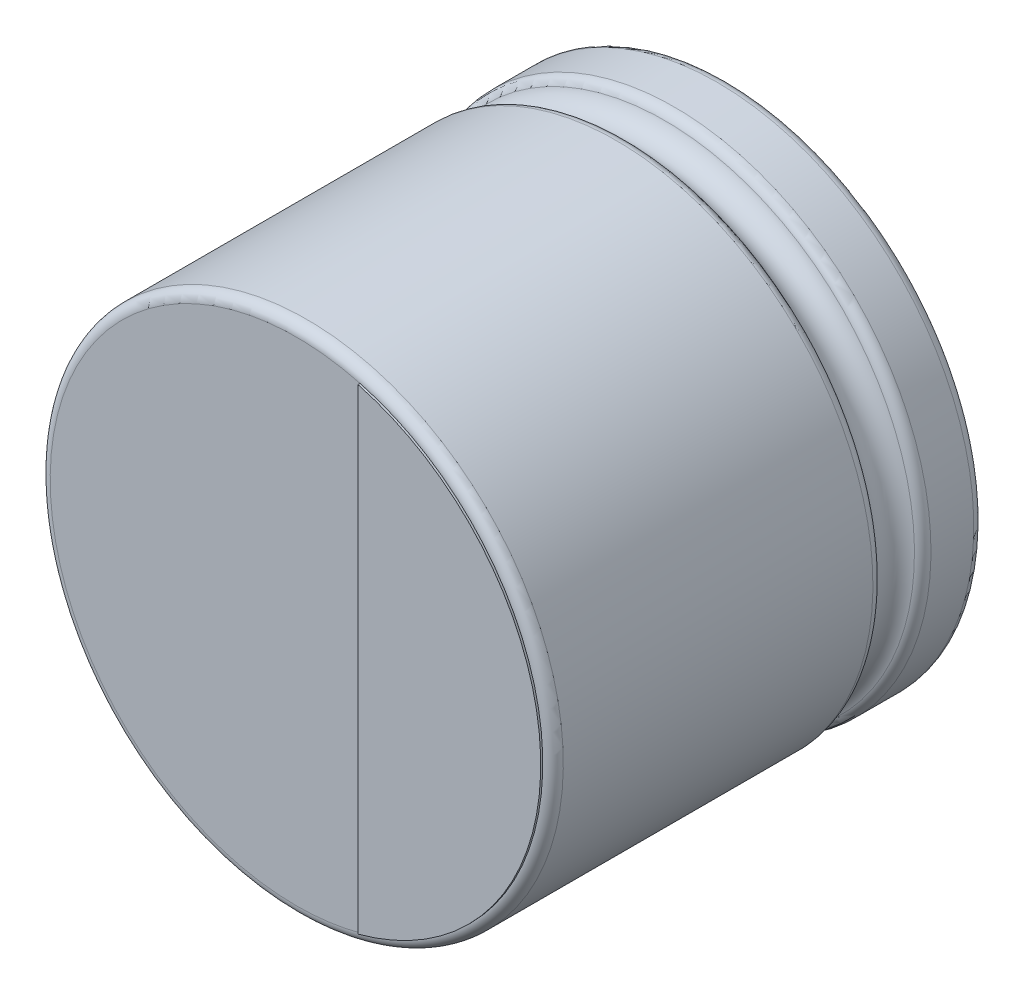
ISO-10303-21;
HEADER;
FILE_DESCRIPTION(('STEP AP214'),'2;1');
FILE_NAME('part.step','',(''),(''),'','','');
FILE_SCHEMA(('AUTOMOTIVE_DESIGN { 1 0 10303 214 1 1 1 1 }'));
ENDSEC;
DATA;
#1=APPLICATION_CONTEXT('core data for automotive mechanical design processes');
#2=APPLICATION_PROTOCOL_DEFINITION('international standard','automotive_design',2000,#1);
#3=PRODUCT_CONTEXT('',#1,'mechanical');
#4=PRODUCT('Part','Part','',(#3));
#5=PRODUCT_RELATED_PRODUCT_CATEGORY('part','',(#4));
#6=PRODUCT_DEFINITION_FORMATION('','',#4);
#7=PRODUCT_DEFINITION_CONTEXT('part definition',#1,'design');
#8=PRODUCT_DEFINITION('design','',#6,#7);
#9=PRODUCT_DEFINITION_SHAPE('','',#8);
#10=(LENGTH_UNIT() NAMED_UNIT(*) SI_UNIT(.MILLI.,.METRE.));
#11=(NAMED_UNIT(*) PLANE_ANGLE_UNIT() SI_UNIT($,.RADIAN.));
#12=(NAMED_UNIT(*) SI_UNIT($,.STERADIAN.) SOLID_ANGLE_UNIT());
#13=UNCERTAINTY_MEASURE_WITH_UNIT(LENGTH_MEASURE(1.E-05),#10,'distance_accuracy_value','');
#14=(GEOMETRIC_REPRESENTATION_CONTEXT(3) GLOBAL_UNCERTAINTY_ASSIGNED_CONTEXT((#13)) GLOBAL_UNIT_ASSIGNED_CONTEXT((#10,
#11,#12)) REPRESENTATION_CONTEXT('',''));
#15=CARTESIAN_POINT('',(0.,0.,0.));
#16=DIRECTION('',(0.,0.,1.));
#17=DIRECTION('',(1.,0.,0.));
#18=AXIS2_PLACEMENT_3D('',#15,#16,#17);
#19=CARTESIAN_POINT('',(10.549,-3.885,7.12));
#20=DIRECTION('',(0.,0.,1.));
#21=DIRECTION('',(1.,0.,0.));
#22=AXIS2_PLACEMENT_3D('',#19,#20,#21);
#23=PLANE('',#22);
#24=DIRECTION('',(0.,1.,0.));
#25=VECTOR('',#24,1.);
#26=CARTESIAN_POINT('',(11.16804339705,-6.203789613704,7.12000000001));
#27=LINE('',#26,#25);
#28=CARTESIAN_POINT('',(11.16804339704,-6.203789613694,7.12));
#29=VERTEX_POINT('',#28);
#30=CARTESIAN_POINT('',(11.16804339704,-1.566210386306,7.12));
#31=VERTEX_POINT('',#30);
#32=EDGE_CURVE('E121',#29,#31,#27,.T.);
#33=ORIENTED_EDGE('',*,*,#32,.F.);
#34=CARTESIAN_POINT('',(10.54900000001,-3.88500000001,7.12000000001));
#35=DIRECTION('',(0.,0.,1.));
#36=DIRECTION('',(0.257934748771542,-0.966162339038405,0.));
#37=AXIS2_PLACEMENT_3D('',#34,#35,#36);
#38=CIRCLE('',#37,2.40000000001224);
#39=EDGE_CURVE('E11',#29,#31,#38,.T.);
#40=ORIENTED_EDGE('',*,*,#39,.T.);
#41=EDGE_LOOP('',(#33,#40));
#42=FACE_BOUND('',#41,.T.);
#43=ADVANCED_FACE('F17',(#42),#23,.T.);
#44=CARTESIAN_POINT('',(10.549,-3.885,7.12));
#45=DIRECTION('',(0.,0.,-1.));
#46=DIRECTION('',(0.,1.,0.));
#47=AXIS2_PLACEMENT_3D('',#44,#45,#46);
#48=CYLINDRICAL_SURFACE('',#47,2.4);
#49=DIRECTION('',(5.00088817591926E-10,0.,1.));
#50=VECTOR('',#49,1.);
#51=CARTESIAN_POINT('',(11.16804339705,-1.566210386316,7.10000000001));
#52=LINE('',#51,#50);
#53=CARTESIAN_POINT('',(11.16804339704,-1.566210386306,7.1));
#54=VERTEX_POINT('',#53);
#55=EDGE_CURVE('E21',#54,#31,#52,.T.);
#56=ORIENTED_EDGE('',*,*,#55,.T.);
#57=ORIENTED_EDGE('',*,*,#39,.F.);
#58=DIRECTION('',(-5.00088817591926E-10,-5.00044408670963E-10,-1.));
#59=VECTOR('',#58,1.);
#60=CARTESIAN_POINT('',(11.16804339705,-6.203789613704,7.12000000001));
#61=LINE('',#60,#59);
#62=CARTESIAN_POINT('',(11.16804339704,-6.203789613694,7.1));
#63=VERTEX_POINT('',#62);
#64=EDGE_CURVE('E109',#29,#63,#61,.T.);
#65=ORIENTED_EDGE('',*,*,#64,.T.);
#66=CARTESIAN_POINT('',(10.54900000001,-3.88500000001,7.10000000001));
#67=DIRECTION('',(0.,0.,-1.));
#68=DIRECTION('',(0.257934748771542,0.966162339038405,0.));
#69=AXIS2_PLACEMENT_3D('',#66,#67,#68);
#70=CIRCLE('',#69,2.40000000001224);
#71=EDGE_CURVE('E101',#54,#63,#70,.T.);
#72=ORIENTED_EDGE('',*,*,#71,.F.);
#73=EDGE_LOOP('',(#56,#57,#65,#72));
#74=FACE_BOUND('',#73,.T.);
#75=ADVANCED_FACE('F132',(#74),#48,.T.);
#76=CARTESIAN_POINT('',(11.16804339704,-6.203789613694,7.12));
#77=DIRECTION('',(1.,0.,0.));
#78=DIRECTION('',(0.,1.,0.));
#79=AXIS2_PLACEMENT_3D('',#76,#77,#78);
#80=PLANE('',#79);
#81=ORIENTED_EDGE('',*,*,#64,.F.);
#82=ORIENTED_EDGE('',*,*,#32,.T.);
#83=ORIENTED_EDGE('',*,*,#55,.F.);
#84=DIRECTION('',(0.,1.,0.));
#85=VECTOR('',#84,1.);
#86=CARTESIAN_POINT('',(11.16804339705,-6.203789613704,7.10000000001));
#87=LINE('',#86,#85);
#88=EDGE_CURVE('E100',#63,#54,#87,.T.);
#89=ORIENTED_EDGE('',*,*,#88,.F.);
#90=EDGE_LOOP('',(#81,#82,#83,#89));
#91=FACE_BOUND('',#90,.T.);
#92=ADVANCED_FACE('F19',(#91),#80,.F.);
#93=CARTESIAN_POINT('',(10.549,-3.885,7.1));
#94=DIRECTION('',(0.,0.,1.));
#95=DIRECTION('',(1.,0.,0.));
#96=AXIS2_PLACEMENT_3D('',#93,#94,#95);
#97=PLANE('',#96);
#98=CARTESIAN_POINT('',(10.54900000001,-3.88500000001,7.10000000001));
#99=DIRECTION('',(0.,0.,1.));
#100=DIRECTION('',(0.,1.,0.));
#101=AXIS2_PLACEMENT_3D('',#98,#99,#100);
#102=CIRCLE('',#101,2.40000000001);
#103=EDGE_CURVE('E96',#54,#63,#102,.T.);
#104=ORIENTED_EDGE('',*,*,#103,.T.);
#105=ORIENTED_EDGE('',*,*,#88,.T.);
#106=EDGE_LOOP('',(#104,#105));
#107=FACE_BOUND('',#106,.T.);
#108=ADVANCED_FACE('F136',(#107),#97,.T.);
#109=CARTESIAN_POINT('',(10.549,-3.885,7.));
#110=DIRECTION('',(0.,0.,1.));
#111=DIRECTION('',(0.,-1.,0.));
#112=AXIS2_PLACEMENT_3D('',#109,#110,#111);
#113=TOROIDAL_SURFACE('',#112,2.4,0.1);
#114=ORIENTED_EDGE('',*,*,#71,.T.);
#115=ORIENTED_EDGE('',*,*,#103,.F.);
#116=EDGE_LOOP('',(#114,#115));
#117=FACE_BOUND('',#116,.T.);
#118=CARTESIAN_POINT('',(10.54900000001,-3.88500000001,7.00000000001));
#119=DIRECTION('',(0.,0.,1.));
#120=DIRECTION('',(0.,-1.,0.));
#121=AXIS2_PLACEMENT_3D('',#118,#119,#120);
#122=CIRCLE('',#121,2.50000000001);
#123=CARTESIAN_POINT('',(10.54900000001,-6.38500000002,7.00000000001));
#124=VERTEX_POINT('',#123);
#125=EDGE_CURVE('E104',#124,#124,#122,.T.);
#126=ORIENTED_EDGE('',*,*,#125,.T.);
#127=EDGE_LOOP('',(#126));
#128=FACE_BOUND('',#127,.T.);
#129=ADVANCED_FACE('F138',(#117,#128),#113,.T.);
#130=CARTESIAN_POINT('',(10.549,-3.885,1.383250606962));
#131=DIRECTION('',(0.,0.,-1.));
#132=DIRECTION('',(0.,1.,0.));
#133=AXIS2_PLACEMENT_3D('',#130,#131,#132);
#134=CYLINDRICAL_SURFACE('',#133,2.5);
#135=CARTESIAN_POINT('',(10.54900000001,-3.88500000001,3.982842712485));
#136=DIRECTION('',(0.,0.,-1.));
#137=DIRECTION('',(0.,-1.,0.));
#138=AXIS2_PLACEMENT_3D('',#135,#136,#137);
#139=CIRCLE('',#138,2.50000000001);
#140=CARTESIAN_POINT('',(10.54900000001,-6.38500000002,3.982842712485));
#141=VERTEX_POINT('',#140);
#142=EDGE_CURVE('E95',#141,#141,#139,.T.);
#143=ORIENTED_EDGE('',*,*,#142,.F.);
#144=EDGE_LOOP('',(#143));
#145=FACE_BOUND('',#144,.T.);
#146=ORIENTED_EDGE('',*,*,#125,.F.);
#147=EDGE_LOOP('',(#146));
#148=FACE_BOUND('',#147,.T.);
#149=ADVANCED_FACE('F141',(#145,#148),#134,.T.);
#150=CARTESIAN_POINT('',(10.549,-3.885,3.982842712475));
#151=DIRECTION('',(0.,0.,1.));
#152=DIRECTION('',(0.,-1.,0.));
#153=AXIS2_PLACEMENT_3D('',#150,#151,#152);
#154=TOROIDAL_SURFACE('',#153,2.4,0.1);
#155=ORIENTED_EDGE('',*,*,#142,.T.);
#156=EDGE_LOOP('',(#155));
#157=FACE_BOUND('',#156,.T.);
#158=CARTESIAN_POINT('',(10.54900000001,-3.88500000001,3.888561808326));
#159=DIRECTION('',(0.,0.,1.));
#160=DIRECTION('',(0.,-1.,0.));
#161=AXIS2_PLACEMENT_3D('',#158,#159,#160);
#162=CIRCLE('',#161,2.433333333343);
#163=CARTESIAN_POINT('',(10.54900000001,-6.318333333353,3.888561808326));
#164=VERTEX_POINT('',#163);
#165=EDGE_CURVE('E85',#164,#164,#162,.T.);
#166=ORIENTED_EDGE('',*,*,#165,.T.);
#167=EDGE_LOOP('',(#166));
#168=FACE_BOUND('',#167,.T.);
#169=ADVANCED_FACE('F146',(#157,#168),#154,.T.);
#170=CARTESIAN_POINT('',(10.549,-6.385,2.9));
#171=DIRECTION('',(0.,0.,-1.));
#172=DIRECTION('',(0.,-1.,0.));
#173=AXIS2_PLACEMENT_3D('',#170,#171,#172);
#174=PLANE('',#173);
#175=CARTESIAN_POINT('',(10.54900000001,-3.88500000001,2.90000000001));
#176=DIRECTION('',(0.,0.,-1.));
#177=DIRECTION('',(0.,1.,0.));
#178=AXIS2_PLACEMENT_3D('',#175,#176,#177);
#179=CIRCLE('',#178,2.40000000001);
#180=CARTESIAN_POINT('',(10.54900000001,-1.485,2.90000000001));
#181=VERTEX_POINT('',#180);
#182=EDGE_CURVE('E110',#181,#181,#179,.T.);
#183=ORIENTED_EDGE('',*,*,#182,.T.);
#184=EDGE_LOOP('',(#183));
#185=FACE_BOUND('',#184,.T.);
#186=ADVANCED_FACE('F154',(#185),#174,.T.);
#187=CARTESIAN_POINT('',(10.549,-3.885,3.));
#188=DIRECTION('',(0.,0.,-1.));
#189=DIRECTION('',(0.,1.,0.));
#190=AXIS2_PLACEMENT_3D('',#187,#188,#189);
#191=TOROIDAL_SURFACE('',#190,2.4,0.1);
#192=ORIENTED_EDGE('',*,*,#182,.F.);
#193=EDGE_LOOP('',(#192));
#194=FACE_BOUND('',#193,.T.);
#195=CARTESIAN_POINT('',(10.54900000001,-3.88500000001,3.00000000001));
#196=DIRECTION('',(0.,0.,-1.));
#197=DIRECTION('',(0.,-1.,0.));
#198=AXIS2_PLACEMENT_3D('',#195,#196,#197);
#199=CIRCLE('',#198,2.50000000001);
#200=CARTESIAN_POINT('',(10.54900000001,-6.38500000002,3.00000000001));
#201=VERTEX_POINT('',#200);
#202=EDGE_CURVE('E113',#201,#201,#199,.T.);
#203=ORIENTED_EDGE('',*,*,#202,.T.);
#204=EDGE_LOOP('',(#203));
#205=FACE_BOUND('',#204,.T.);
#206=ADVANCED_FACE('F226',(#194,#205),#191,.T.);
#207=CARTESIAN_POINT('',(10.549,-3.885,1.383250606962));
#208=DIRECTION('',(0.,0.,-1.));
#209=DIRECTION('',(0.,1.,0.));
#210=AXIS2_PLACEMENT_3D('',#207,#208,#209);
#211=CYLINDRICAL_SURFACE('',#210,2.5);
#212=ORIENTED_EDGE('',*,*,#202,.F.);
#213=EDGE_LOOP('',(#212));
#214=FACE_BOUND('',#213,.T.);
#215=CARTESIAN_POINT('',(10.54900000001,-3.88500000001,3.417157287535));
#216=DIRECTION('',(0.,0.,1.));
#217=DIRECTION('',(0.,-1.,0.));
#218=AXIS2_PLACEMENT_3D('',#215,#216,#217);
#219=CIRCLE('',#218,2.50000000001);
#220=CARTESIAN_POINT('',(10.54900000001,-6.38500000002,3.417157287535));
#221=VERTEX_POINT('',#220);
#222=EDGE_CURVE('E91',#221,#221,#219,.T.);
#223=ORIENTED_EDGE('',*,*,#222,.F.);
#224=EDGE_LOOP('',(#223));
#225=FACE_BOUND('',#224,.T.);
#226=ADVANCED_FACE('F237',(#214,#225),#211,.T.);
#227=CARTESIAN_POINT('',(10.549,-3.885,3.417157287525));
#228=DIRECTION('',(0.,0.,1.));
#229=DIRECTION('',(0.,-1.,0.));
#230=AXIS2_PLACEMENT_3D('',#227,#228,#229);
#231=TOROIDAL_SURFACE('',#230,2.4,0.1);
#232=CARTESIAN_POINT('',(10.54900000001,-3.88500000001,3.511438191694));
#233=DIRECTION('',(0.,0.,-1.));
#234=DIRECTION('',(0.,-1.,0.));
#235=AXIS2_PLACEMENT_3D('',#232,#233,#234);
#236=CIRCLE('',#235,2.433333333343);
#237=CARTESIAN_POINT('',(10.54900000001,-6.318333333353,3.511438191694));
#238=VERTEX_POINT('',#237);
#239=EDGE_CURVE('E80',#238,#238,#236,.T.);
#240=ORIENTED_EDGE('',*,*,#239,.T.);
#241=EDGE_LOOP('',(#240));
#242=FACE_BOUND('',#241,.T.);
#243=ORIENTED_EDGE('',*,*,#222,.T.);
#244=EDGE_LOOP('',(#243));
#245=FACE_BOUND('',#244,.T.);
#246=ADVANCED_FACE('F81',(#242,#245),#231,.T.);
#247=CARTESIAN_POINT('',(10.549,-3.885,3.7));
#248=DIRECTION('',(0.,0.,-1.));
#249=DIRECTION('',(0.,1.,0.));
#250=AXIS2_PLACEMENT_3D('',#247,#248,#249);
#251=TOROIDAL_SURFACE('',#250,2.5,0.2);
#252=ORIENTED_EDGE('',*,*,#165,.F.);
#253=EDGE_LOOP('',(#252));
#254=FACE_BOUND('',#253,.T.);
#255=ORIENTED_EDGE('',*,*,#239,.F.);
#256=EDGE_LOOP('',(#255));
#257=FACE_BOUND('',#256,.T.);
#258=ADVANCED_FACE('F258',(#254,#257),#251,.F.);
#259=CLOSED_SHELL('',(#43,#75,#92,#108,#129,#149,#169,#186,#206,#226,#246,#258));
#260=MANIFOLD_SOLID_BREP('B1',#259);
#261=ADVANCED_BREP_SHAPE_REPRESENTATION('',(#18,#260),#14);
#262=SHAPE_DEFINITION_REPRESENTATION(#9,#261);
ENDSEC;
END-ISO-10303-21;
